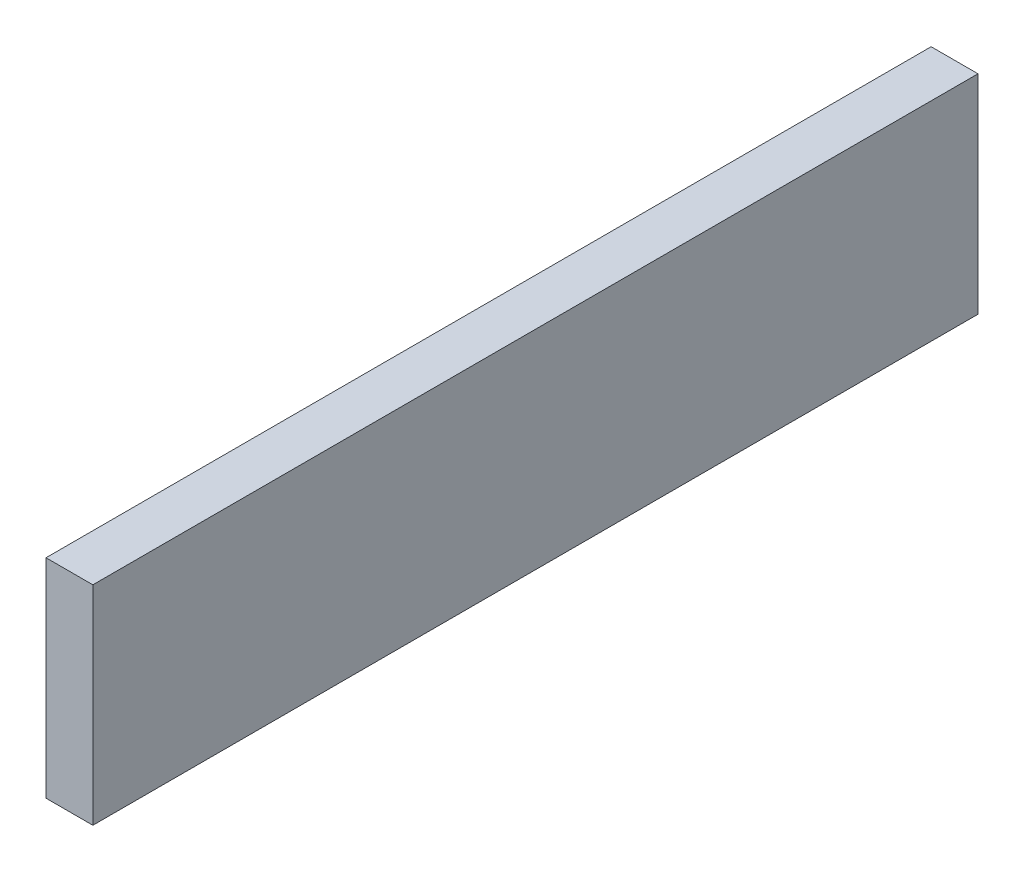
ISO-10303-21;
HEADER;
FILE_DESCRIPTION(('STEP AP214'),'2;1');
FILE_NAME('part.step','',(''),(''),'','','');
FILE_SCHEMA(('AUTOMOTIVE_DESIGN { 1 0 10303 214 1 1 1 1 }'));
ENDSEC;
DATA;
#1=APPLICATION_CONTEXT('core data for automotive mechanical design processes');
#2=APPLICATION_PROTOCOL_DEFINITION('international standard','automotive_design',2000,#1);
#3=PRODUCT_CONTEXT('',#1,'mechanical');
#4=PRODUCT('Part','Part','',(#3));
#5=PRODUCT_RELATED_PRODUCT_CATEGORY('part','',(#4));
#6=PRODUCT_DEFINITION_FORMATION('','',#4);
#7=PRODUCT_DEFINITION_CONTEXT('part definition',#1,'design');
#8=PRODUCT_DEFINITION('design','',#6,#7);
#9=PRODUCT_DEFINITION_SHAPE('','',#8);
#10=(LENGTH_UNIT() NAMED_UNIT(*) SI_UNIT(.MILLI.,.METRE.));
#11=(NAMED_UNIT(*) PLANE_ANGLE_UNIT() SI_UNIT($,.RADIAN.));
#12=(NAMED_UNIT(*) SI_UNIT($,.STERADIAN.) SOLID_ANGLE_UNIT());
#13=UNCERTAINTY_MEASURE_WITH_UNIT(LENGTH_MEASURE(1.E-05),#10,'distance_accuracy_value','');
#14=(GEOMETRIC_REPRESENTATION_CONTEXT(3) GLOBAL_UNCERTAINTY_ASSIGNED_CONTEXT((#13)) GLOBAL_UNIT_ASSIGNED_CONTEXT((#10,
#11,#12)) REPRESENTATION_CONTEXT('',''));
#15=CARTESIAN_POINT('',(0.,0.,0.));
#16=DIRECTION('',(0.,0.,1.));
#17=DIRECTION('',(1.,0.,0.));
#18=AXIS2_PLACEMENT_3D('',#15,#16,#17);
#19=CARTESIAN_POINT('',(0.,0.,85.));
#20=DIRECTION('',(1.,0.,0.));
#21=DIRECTION('',(0.,0.,-1.));
#22=AXIS2_PLACEMENT_3D('',#19,#20,#21);
#23=PLANE('',#22);
#24=DIRECTION('',(0.,-1.,0.));
#25=VECTOR('',#24,1.);
#26=CARTESIAN_POINT('',(0.,20.,0.));
#27=LINE('',#26,#25);
#28=CARTESIAN_POINT('',(0.,20.,0.));
#29=VERTEX_POINT('',#28);
#30=CARTESIAN_POINT('',(0.,0.,0.));
#31=VERTEX_POINT('',#30);
#32=EDGE_CURVE('E9',#29,#31,#27,.T.);
#33=ORIENTED_EDGE('',*,*,#32,.T.);
#34=DIRECTION('',(0.,0.,-1.));
#35=VECTOR('',#34,1.);
#36=CARTESIAN_POINT('',(0.,0.,85.));
#37=LINE('',#36,#35);
#38=CARTESIAN_POINT('',(0.,0.,85.));
#39=VERTEX_POINT('',#38);
#40=EDGE_CURVE('E34',#39,#31,#37,.T.);
#41=ORIENTED_EDGE('',*,*,#40,.F.);
#42=DIRECTION('',(0.,-1.,0.));
#43=VECTOR('',#42,1.);
#44=CARTESIAN_POINT('',(0.,20.,85.));
#45=LINE('',#44,#43);
#46=CARTESIAN_POINT('',(0.,20.,85.));
#47=VERTEX_POINT('',#46);
#48=EDGE_CURVE('E71',#47,#39,#45,.T.);
#49=ORIENTED_EDGE('',*,*,#48,.F.);
#50=DIRECTION('',(0.,0.,-1.));
#51=VECTOR('',#50,1.);
#52=CARTESIAN_POINT('',(0.,20.,85.));
#53=LINE('',#52,#51);
#54=EDGE_CURVE('E25',#47,#29,#53,.T.);
#55=ORIENTED_EDGE('',*,*,#54,.T.);
#56=EDGE_LOOP('',(#33,#41,#49,#55));
#57=FACE_BOUND('',#56,.T.);
#58=ADVANCED_FACE('F15',(#57),#23,.F.);
#59=CARTESIAN_POINT('',(0.,0.,85.));
#60=DIRECTION('',(0.,1.,0.));
#61=DIRECTION('',(0.,0.,1.));
#62=AXIS2_PLACEMENT_3D('',#59,#60,#61);
#63=PLANE('',#62);
#64=DIRECTION('',(1.,0.,0.));
#65=VECTOR('',#64,1.);
#66=CARTESIAN_POINT('',(0.,0.,0.));
#67=LINE('',#66,#65);
#68=CARTESIAN_POINT('',(4.5,0.,0.));
#69=VERTEX_POINT('',#68);
#70=EDGE_CURVE('E78',#31,#69,#67,.T.);
#71=ORIENTED_EDGE('',*,*,#70,.T.);
#72=DIRECTION('',(0.,0.,-1.));
#73=VECTOR('',#72,1.);
#74=CARTESIAN_POINT('',(4.5,0.,85.));
#75=LINE('',#74,#73);
#76=CARTESIAN_POINT('',(4.5,0.,85.));
#77=VERTEX_POINT('',#76);
#78=EDGE_CURVE('E84',#77,#69,#75,.T.);
#79=ORIENTED_EDGE('',*,*,#78,.F.);
#80=DIRECTION('',(1.,0.,0.));
#81=VECTOR('',#80,1.);
#82=CARTESIAN_POINT('',(0.,0.,85.));
#83=LINE('',#82,#81);
#84=EDGE_CURVE('E62',#39,#77,#83,.T.);
#85=ORIENTED_EDGE('',*,*,#84,.F.);
#86=ORIENTED_EDGE('',*,*,#40,.T.);
#87=EDGE_LOOP('',(#71,#79,#85,#86));
#88=FACE_BOUND('',#87,.T.);
#89=ADVANCED_FACE('F88',(#88),#63,.F.);
#90=CARTESIAN_POINT('',(4.5,0.,85.));
#91=DIRECTION('',(-1.,0.,0.));
#92=DIRECTION('',(0.,0.,1.));
#93=AXIS2_PLACEMENT_3D('',#90,#91,#92);
#94=PLANE('',#93);
#95=DIRECTION('',(0.,1.,0.));
#96=VECTOR('',#95,1.);
#97=CARTESIAN_POINT('',(4.5,0.,0.));
#98=LINE('',#97,#96);
#99=CARTESIAN_POINT('',(4.5,20.,0.));
#100=VERTEX_POINT('',#99);
#101=EDGE_CURVE('E68',#69,#100,#98,.T.);
#102=ORIENTED_EDGE('',*,*,#101,.T.);
#103=DIRECTION('',(0.,0.,-1.));
#104=VECTOR('',#103,1.);
#105=CARTESIAN_POINT('',(4.5,20.,85.));
#106=LINE('',#105,#104);
#107=CARTESIAN_POINT('',(4.5,20.,85.));
#108=VERTEX_POINT('',#107);
#109=EDGE_CURVE('E54',#108,#100,#106,.T.);
#110=ORIENTED_EDGE('',*,*,#109,.F.);
#111=DIRECTION('',(0.,1.,0.));
#112=VECTOR('',#111,1.);
#113=CARTESIAN_POINT('',(4.5,0.,85.));
#114=LINE('',#113,#112);
#115=EDGE_CURVE('E60',#77,#108,#114,.T.);
#116=ORIENTED_EDGE('',*,*,#115,.F.);
#117=ORIENTED_EDGE('',*,*,#78,.T.);
#118=EDGE_LOOP('',(#102,#110,#116,#117));
#119=FACE_BOUND('',#118,.T.);
#120=ADVANCED_FACE('F66',(#119),#94,.F.);
#121=CARTESIAN_POINT('',(0.,20.,85.));
#122=DIRECTION('',(0.,-1.,0.));
#123=DIRECTION('',(0.,0.,-1.));
#124=AXIS2_PLACEMENT_3D('',#121,#122,#123);
#125=PLANE('',#124);
#126=DIRECTION('',(-1.,0.,0.));
#127=VECTOR('',#126,1.);
#128=CARTESIAN_POINT('',(4.5,20.,0.));
#129=LINE('',#128,#127);
#130=EDGE_CURVE('E70',#100,#29,#129,.T.);
#131=ORIENTED_EDGE('',*,*,#130,.T.);
#132=ORIENTED_EDGE('',*,*,#54,.F.);
#133=DIRECTION('',(-1.,0.,0.));
#134=VECTOR('',#133,1.);
#135=CARTESIAN_POINT('',(4.5,20.,85.));
#136=LINE('',#135,#134);
#137=EDGE_CURVE('E19',#108,#47,#136,.T.);
#138=ORIENTED_EDGE('',*,*,#137,.F.);
#139=ORIENTED_EDGE('',*,*,#109,.T.);
#140=EDGE_LOOP('',(#131,#132,#138,#139));
#141=FACE_BOUND('',#140,.T.);
#142=ADVANCED_FACE('F74',(#141),#125,.F.);
#143=CARTESIAN_POINT('',(0.,0.,85.));
#144=DIRECTION('',(0.,0.,-1.));
#145=DIRECTION('',(-1.,0.,0.));
#146=AXIS2_PLACEMENT_3D('',#143,#144,#145);
#147=PLANE('',#146);
#148=ORIENTED_EDGE('',*,*,#48,.T.);
#149=ORIENTED_EDGE('',*,*,#84,.T.);
#150=ORIENTED_EDGE('',*,*,#115,.T.);
#151=ORIENTED_EDGE('',*,*,#137,.T.);
#152=EDGE_LOOP('',(#148,#149,#150,#151));
#153=FACE_BOUND('',#152,.T.);
#154=ADVANCED_FACE('F61',(#153),#147,.F.);
#155=CARTESIAN_POINT('',(0.,0.,0.));
#156=DIRECTION('',(0.,0.,-1.));
#157=DIRECTION('',(-1.,0.,0.));
#158=AXIS2_PLACEMENT_3D('',#155,#156,#157);
#159=PLANE('',#158);
#160=ORIENTED_EDGE('',*,*,#32,.F.);
#161=ORIENTED_EDGE('',*,*,#130,.F.);
#162=ORIENTED_EDGE('',*,*,#101,.F.);
#163=ORIENTED_EDGE('',*,*,#70,.F.);
#164=EDGE_LOOP('',(#160,#161,#162,#163));
#165=FACE_BOUND('',#164,.T.);
#166=ADVANCED_FACE('F17',(#165),#159,.T.);
#167=CLOSED_SHELL('',(#58,#89,#120,#142,#154,#166));
#168=MANIFOLD_SOLID_BREP('B1',#167);
#169=ADVANCED_BREP_SHAPE_REPRESENTATION('',(#18,#168),#14);
#170=SHAPE_DEFINITION_REPRESENTATION(#9,#169);
ENDSEC;
END-ISO-10303-21;
